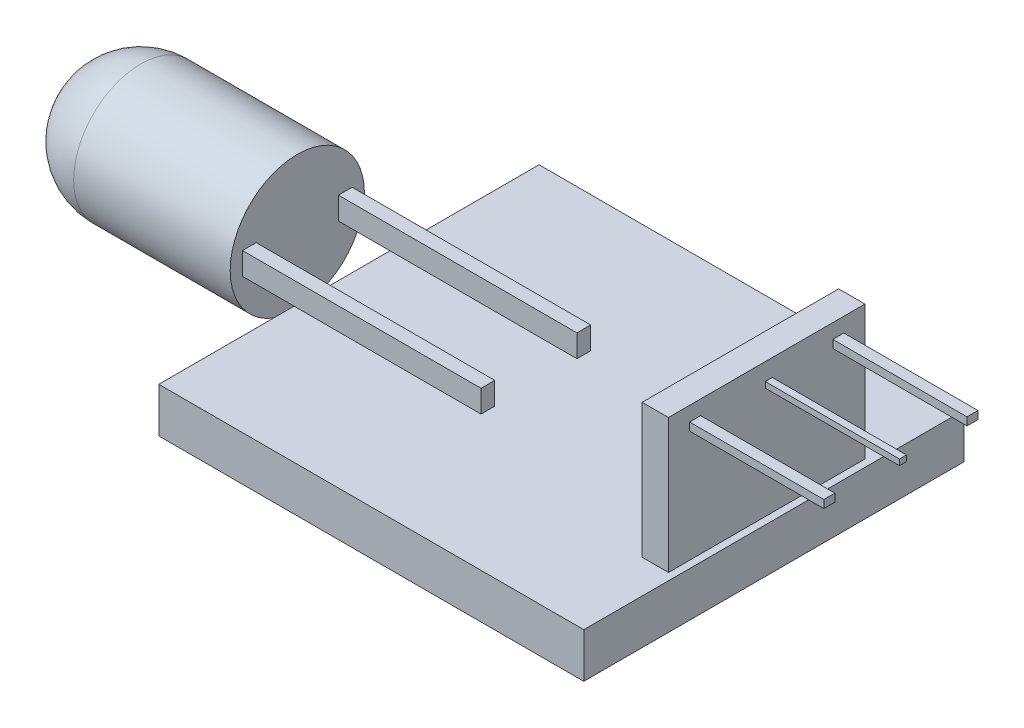
ISO-10303-21;
HEADER;
FILE_DESCRIPTION(('STEP AP214'),'2;1');
FILE_NAME('part.step','',(''),(''),'','','');
FILE_SCHEMA(('AUTOMOTIVE_DESIGN { 1 0 10303 214 1 1 1 1 }'));
ENDSEC;
DATA;
#1=APPLICATION_CONTEXT('core data for automotive mechanical design processes');
#2=APPLICATION_PROTOCOL_DEFINITION('international standard','automotive_design',2000,#1);
#3=PRODUCT_CONTEXT('',#1,'mechanical');
#4=PRODUCT('Part','Part','',(#3));
#5=PRODUCT_RELATED_PRODUCT_CATEGORY('part','',(#4));
#6=PRODUCT_DEFINITION_FORMATION('','',#4);
#7=PRODUCT_DEFINITION_CONTEXT('part definition',#1,'design');
#8=PRODUCT_DEFINITION('design','',#6,#7);
#9=PRODUCT_DEFINITION_SHAPE('','',#8);
#10=(LENGTH_UNIT() NAMED_UNIT(*) SI_UNIT(.MILLI.,.METRE.));
#11=(NAMED_UNIT(*) PLANE_ANGLE_UNIT() SI_UNIT($,.RADIAN.));
#12=(NAMED_UNIT(*) SI_UNIT($,.STERADIAN.) SOLID_ANGLE_UNIT());
#13=UNCERTAINTY_MEASURE_WITH_UNIT(LENGTH_MEASURE(1.E-05),#10,'distance_accuracy_value','');
#14=(GEOMETRIC_REPRESENTATION_CONTEXT(3) GLOBAL_UNCERTAINTY_ASSIGNED_CONTEXT((#13)) GLOBAL_UNIT_ASSIGNED_CONTEXT((#10,
#11,#12)) REPRESENTATION_CONTEXT('',''));
#15=CARTESIAN_POINT('',(0.,0.,0.));
#16=DIRECTION('',(0.,0.,1.));
#17=DIRECTION('',(1.,0.,0.));
#18=AXIS2_PLACEMENT_3D('',#15,#16,#17);
#19=CARTESIAN_POINT('',(0.,2.,0.));
#20=DIRECTION('',(0.,1.,0.));
#21=DIRECTION('',(0.,0.,1.));
#22=AXIS2_PLACEMENT_3D('',#19,#20,#21);
#23=PLANE('',#22);
#24=DIRECTION('',(-1.,0.,0.));
#25=VECTOR('',#24,1.);
#26=CARTESIAN_POINT('',(-1.80664428029186,2.,-1.83779397914057));
#27=LINE('',#26,#25);
#28=CARTESIAN_POINT('',(-1.1429964544911,2.,-1.83779397914057));
#29=VERTEX_POINT('',#28);
#30=CARTESIAN_POINT('',(-9.5,2.,-1.83779397914057));
#31=VERTEX_POINT('',#30);
#32=EDGE_CURVE('E55',#29,#31,#27,.T.);
#33=ORIENTED_EDGE('',*,*,#32,.T.);
#34=DIRECTION('',(0.,0.,1.));
#35=VECTOR('',#34,1.);
#36=CARTESIAN_POINT('',(-9.5,2.,-8.5));
#37=LINE('',#36,#35);
#38=CARTESIAN_POINT('',(-9.5,2.,1.83779397914057));
#39=VERTEX_POINT('',#38);
#40=EDGE_CURVE('E550',#31,#39,#37,.T.);
#41=ORIENTED_EDGE('',*,*,#40,.T.);
#42=DIRECTION('',(-1.,0.,0.));
#43=VECTOR('',#42,1.);
#44=CARTESIAN_POINT('',(-1.80664428029186,2.,1.83779397914057));
#45=LINE('',#44,#43);
#46=CARTESIAN_POINT('',(-1.1429964544911,2.,1.83779397914057));
#47=VERTEX_POINT('',#46);
#48=EDGE_CURVE('E336',#47,#39,#45,.T.);
#49=ORIENTED_EDGE('',*,*,#48,.F.);
#50=DIRECTION('',(0.,0.,-1.));
#51=VECTOR('',#50,1.);
#52=CARTESIAN_POINT('',(-1.1429964544911,2.,1.83779397914057));
#53=LINE('',#52,#51);
#54=CARTESIAN_POINT('',(-1.1429964544911,2.,2.45039197218743));
#55=VERTEX_POINT('',#54);
#56=EDGE_CURVE('E346',#55,#47,#53,.T.);
#57=ORIENTED_EDGE('',*,*,#56,.F.);
#58=DIRECTION('',(1.,0.,0.));
#59=VECTOR('',#58,1.);
#60=CARTESIAN_POINT('',(-1.80664428029186,2.,2.45039197218743));
#61=LINE('',#60,#59);
#62=CARTESIAN_POINT('',(-9.5,2.,2.45039197218743));
#63=VERTEX_POINT('',#62);
#64=EDGE_CURVE('E331',#63,#55,#61,.T.);
#65=ORIENTED_EDGE('',*,*,#64,.F.);
#66=CARTESIAN_POINT('',(-9.49999999999999,2.,8.5));
#67=VERTEX_POINT('',#66);
#68=EDGE_CURVE('E544',#63,#67,#37,.T.);
#69=ORIENTED_EDGE('',*,*,#68,.T.);
#70=DIRECTION('',(1.,0.,0.));
#71=VECTOR('',#70,1.);
#72=CARTESIAN_POINT('',(-9.49999999999999,2.,8.5));
#73=LINE('',#72,#71);
#74=CARTESIAN_POINT('',(9.50000000000001,2.,8.5));
#75=VERTEX_POINT('',#74);
#76=EDGE_CURVE('E549',#67,#75,#73,.T.);
#77=ORIENTED_EDGE('',*,*,#76,.T.);
#78=DIRECTION('',(0.,0.,-1.));
#79=VECTOR('',#78,1.);
#80=CARTESIAN_POINT('',(9.5,2.,-8.5));
#81=LINE('',#80,#79);
#82=CARTESIAN_POINT('',(9.5,2.,-8.5));
#83=VERTEX_POINT('',#82);
#84=EDGE_CURVE('E536',#75,#83,#81,.T.);
#85=ORIENTED_EDGE('',*,*,#84,.T.);
#86=DIRECTION('',(-1.,0.,0.));
#87=VECTOR('',#86,1.);
#88=CARTESIAN_POINT('',(-9.5,2.,-8.5));
#89=LINE('',#88,#87);
#90=CARTESIAN_POINT('',(-9.5,2.,-8.5));
#91=VERTEX_POINT('',#90);
#92=EDGE_CURVE('E540',#83,#91,#89,.T.);
#93=ORIENTED_EDGE('',*,*,#92,.T.);
#94=CARTESIAN_POINT('',(-9.5,2.,-2.45039197218743));
#95=VERTEX_POINT('',#94);
#96=EDGE_CURVE('E545',#91,#95,#37,.T.);
#97=ORIENTED_EDGE('',*,*,#96,.T.);
#98=DIRECTION('',(1.,0.,0.));
#99=VECTOR('',#98,1.);
#100=CARTESIAN_POINT('',(-1.80664428029186,2.,-2.45039197218743));
#101=LINE('',#100,#99);
#102=CARTESIAN_POINT('',(-1.1429964544911,2.,-2.45039197218743));
#103=VERTEX_POINT('',#102);
#104=EDGE_CURVE('E63',#95,#103,#101,.T.);
#105=ORIENTED_EDGE('',*,*,#104,.T.);
#106=DIRECTION('',(0.,0.,1.));
#107=VECTOR('',#106,1.);
#108=CARTESIAN_POINT('',(-1.1429964544911,2.,-1.83779397914057));
#109=LINE('',#108,#107);
#110=EDGE_CURVE('E292',#103,#29,#109,.T.);
#111=ORIENTED_EDGE('',*,*,#110,.T.);
#112=EDGE_LOOP('',(#33,#41,#49,#57,#65,#69,#77,#85,#93,#97,#105,#111));
#113=FACE_BOUND('',#112,.T.);
#114=DIRECTION('',(1.,0.,0.));
#115=VECTOR('',#114,1.);
#116=CARTESIAN_POINT('',(9.1777810006269,2.,4.39257162566455));
#117=LINE('',#116,#115);
#118=CARTESIAN_POINT('',(8.00114241080294,2.,4.39257162566455));
#119=VERTEX_POINT('',#118);
#120=CARTESIAN_POINT('',(9.1777810006269,2.,4.39257162566455));
#121=VERTEX_POINT('',#120);
#122=EDGE_CURVE('E513',#119,#121,#117,.T.);
#123=ORIENTED_EDGE('',*,*,#122,.F.);
#124=DIRECTION('',(0.,0.,1.));
#125=VECTOR('',#124,1.);
#126=CARTESIAN_POINT('',(8.00114241080294,2.,4.39257162566455));
#127=LINE('',#126,#125);
#128=CARTESIAN_POINT('',(8.00114241080294,2.,-4.39257162566455));
#129=VERTEX_POINT('',#128);
#130=EDGE_CURVE('E494',#129,#119,#127,.T.);
#131=ORIENTED_EDGE('',*,*,#130,.F.);
#132=DIRECTION('',(-1.,0.,0.));
#133=VECTOR('',#132,1.);
#134=CARTESIAN_POINT('',(9.1777810006269,2.,-4.39257162566455));
#135=LINE('',#134,#133);
#136=CARTESIAN_POINT('',(9.1777810006269,2.,-4.39257162566455));
#137=VERTEX_POINT('',#136);
#138=EDGE_CURVE('E500',#137,#129,#135,.T.);
#139=ORIENTED_EDGE('',*,*,#138,.F.);
#140=DIRECTION('',(0.,0.,-1.));
#141=VECTOR('',#140,1.);
#142=CARTESIAN_POINT('',(9.1777810006269,2.,4.39257162566455));
#143=LINE('',#142,#141);
#144=EDGE_CURVE('E516',#121,#137,#143,.T.);
#145=ORIENTED_EDGE('',*,*,#144,.F.);
#146=EDGE_LOOP('',(#123,#131,#139,#145));
#147=FACE_BOUND('',#146,.T.);
#148=ADVANCED_FACE('F39',(#113,#147),#23,.T.);
#149=CARTESIAN_POINT('',(9.1777810006269,8.,4.39257162566455));
#150=DIRECTION('',(-1.,0.,0.));
#151=DIRECTION('',(0.,0.,1.));
#152=AXIS2_PLACEMENT_3D('',#149,#150,#151);
#153=PLANE('',#152);
#154=DIRECTION('',(0.,-1.,0.));
#155=VECTOR('',#154,1.);
#156=CARTESIAN_POINT('',(9.1777810006269,7.35132355232617,3.4463804247977));
#157=LINE('',#156,#155);
#158=CARTESIAN_POINT('',(9.1777810006269,7.35132355232617,3.4463804247977));
#159=VERTEX_POINT('',#158);
#160=CARTESIAN_POINT('',(9.1777810006269,6.99965208040804,3.4463804247977));
#161=VERTEX_POINT('',#160);
#162=EDGE_CURVE('E449',#159,#161,#157,.T.);
#163=ORIENTED_EDGE('',*,*,#162,.F.);
#164=DIRECTION('',(0.,0.,1.));
#165=VECTOR('',#164,1.);
#166=CARTESIAN_POINT('',(9.1777810006269,7.35132355232617,3.4463804247977));
#167=LINE('',#166,#165);
#168=CARTESIAN_POINT('',(9.1777810006269,7.35132355232617,2.95404036411231));
#169=VERTEX_POINT('',#168);
#170=EDGE_CURVE('E455',#169,#159,#167,.T.);
#171=ORIENTED_EDGE('',*,*,#170,.F.);
#172=DIRECTION('',(0.,1.,0.));
#173=VECTOR('',#172,1.);
#174=CARTESIAN_POINT('',(9.1777810006269,7.35132355232617,2.95404036411231));
#175=LINE('',#174,#173);
#176=CARTESIAN_POINT('',(9.1777810006269,6.99965208040804,2.95404036411231));
#177=VERTEX_POINT('',#176);
#178=EDGE_CURVE('E472',#177,#169,#175,.T.);
#179=ORIENTED_EDGE('',*,*,#178,.F.);
#180=DIRECTION('',(0.,0.,-1.));
#181=VECTOR('',#180,1.);
#182=CARTESIAN_POINT('',(9.1777810006269,6.99965208040804,3.4463804247977));
#183=LINE('',#182,#181);
#184=EDGE_CURVE('E468',#161,#177,#183,.T.);
#185=ORIENTED_EDGE('',*,*,#184,.F.);
#186=EDGE_LOOP('',(#163,#171,#179,#185));
#187=FACE_BOUND('',#186,.T.);
#188=ORIENTED_EDGE('',*,*,#144,.T.);
#189=DIRECTION('',(0.,-1.,0.));
#190=VECTOR('',#189,1.);
#191=CARTESIAN_POINT('',(9.1777810006269,8.,-4.39257162566455));
#192=LINE('',#191,#190);
#193=CARTESIAN_POINT('',(9.1777810006269,8.,-4.39257162566455));
#194=VERTEX_POINT('',#193);
#195=EDGE_CURVE('E525',#194,#137,#192,.T.);
#196=ORIENTED_EDGE('',*,*,#195,.F.);
#197=DIRECTION('',(0.,0.,-1.));
#198=VECTOR('',#197,1.);
#199=CARTESIAN_POINT('',(9.1777810006269,8.,4.39257162566455));
#200=LINE('',#199,#198);
#201=CARTESIAN_POINT('',(9.1777810006269,8.,4.39257162566455));
#202=VERTEX_POINT('',#201);
#203=EDGE_CURVE('E503',#202,#194,#200,.T.);
#204=ORIENTED_EDGE('',*,*,#203,.F.);
#205=DIRECTION('',(0.,-1.,0.));
#206=VECTOR('',#205,1.);
#207=CARTESIAN_POINT('',(9.1777810006269,8.,4.39257162566455));
#208=LINE('',#207,#206);
#209=EDGE_CURVE('E528',#202,#121,#208,.T.);
#210=ORIENTED_EDGE('',*,*,#209,.T.);
#211=EDGE_LOOP('',(#188,#196,#204,#210));
#212=FACE_BOUND('',#211,.T.);
#213=DIRECTION('',(0.,0.,-1.));
#214=VECTOR('',#213,1.);
#215=CARTESIAN_POINT('',(9.1777810006269,7.35132355232617,-3.4463804247977));
#216=LINE('',#215,#214);
#217=CARTESIAN_POINT('',(9.1777810006269,7.35132355232617,-2.95404036411231));
#218=VERTEX_POINT('',#217);
#219=CARTESIAN_POINT('',(9.1777810006269,7.35132355232617,-3.4463804247977));
#220=VERTEX_POINT('',#219);
#221=EDGE_CURVE('E426',#218,#220,#216,.T.);
#222=ORIENTED_EDGE('',*,*,#221,.T.);
#223=DIRECTION('',(0.,-1.,0.));
#224=VECTOR('',#223,1.);
#225=CARTESIAN_POINT('',(9.1777810006269,7.35132355232617,-3.4463804247977));
#226=LINE('',#225,#224);
#227=CARTESIAN_POINT('',(9.1777810006269,6.99965208040804,-3.4463804247977));
#228=VERTEX_POINT('',#227);
#229=EDGE_CURVE('E404',#220,#228,#226,.T.);
#230=ORIENTED_EDGE('',*,*,#229,.T.);
#231=DIRECTION('',(0.,0.,1.));
#232=VECTOR('',#231,1.);
#233=CARTESIAN_POINT('',(9.1777810006269,6.99965208040804,-3.4463804247977));
#234=LINE('',#233,#232);
#235=CARTESIAN_POINT('',(9.1777810006269,6.99965208040804,-2.95404036411231));
#236=VERTEX_POINT('',#235);
#237=EDGE_CURVE('E410',#228,#236,#234,.T.);
#238=ORIENTED_EDGE('',*,*,#237,.T.);
#239=DIRECTION('',(0.,1.,0.));
#240=VECTOR('',#239,1.);
#241=CARTESIAN_POINT('',(9.1777810006269,7.35132355232617,-2.95404036411231));
#242=LINE('',#241,#240);
#243=EDGE_CURVE('E430',#236,#218,#242,.T.);
#244=ORIENTED_EDGE('',*,*,#243,.T.);
#245=EDGE_LOOP('',(#222,#230,#238,#244));
#246=FACE_BOUND('',#245,.T.);
#247=DIRECTION('',(0.,-1.,0.));
#248=VECTOR('',#247,1.);
#249=CARTESIAN_POINT('',(9.1777810006269,7.22880019291106,0.0643645900515466));
#250=LINE('',#249,#248);
#251=CARTESIAN_POINT('',(9.1777810006269,7.22880019291106,0.0643645900515466));
#252=VERTEX_POINT('',#251);
#253=CARTESIAN_POINT('',(9.1777810006269,6.97107621355553,0.0643645900515466));
#254=VERTEX_POINT('',#253);
#255=EDGE_CURVE('E359',#252,#254,#250,.T.);
#256=ORIENTED_EDGE('',*,*,#255,.F.);
#257=DIRECTION('',(0.,0.,1.));
#258=VECTOR('',#257,1.);
#259=CARTESIAN_POINT('',(9.1777810006269,7.22880019291106,0.0643645900515466));
#260=LINE('',#259,#258);
#261=CARTESIAN_POINT('',(9.1777810006269,7.22880019291106,-0.248789451396059));
#262=VERTEX_POINT('',#261);
#263=EDGE_CURVE('E365',#262,#252,#260,.T.);
#264=ORIENTED_EDGE('',*,*,#263,.F.);
#265=DIRECTION('',(0.,1.,0.));
#266=VECTOR('',#265,1.);
#267=CARTESIAN_POINT('',(9.1777810006269,7.22880019291106,-0.248789451396059));
#268=LINE('',#267,#266);
#269=CARTESIAN_POINT('',(9.1777810006269,6.97107621355553,-0.248789451396059));
#270=VERTEX_POINT('',#269);
#271=EDGE_CURVE('E382',#270,#262,#268,.T.);
#272=ORIENTED_EDGE('',*,*,#271,.F.);
#273=DIRECTION('',(0.,0.,-1.));
#274=VECTOR('',#273,1.);
#275=CARTESIAN_POINT('',(9.1777810006269,6.97107621355553,0.0643645900515466));
#276=LINE('',#275,#274);
#277=EDGE_CURVE('E378',#254,#270,#276,.T.);
#278=ORIENTED_EDGE('',*,*,#277,.F.);
#279=EDGE_LOOP('',(#256,#264,#272,#278));
#280=FACE_BOUND('',#279,.T.);
#281=ADVANCED_FACE('F634',(#187,#212,#246,#280),#153,.F.);
#282=CARTESIAN_POINT('',(9.5,2.,-8.5));
#283=DIRECTION('',(-1.,0.,0.));
#284=DIRECTION('',(0.,0.,1.));
#285=AXIS2_PLACEMENT_3D('',#282,#283,#284);
#286=PLANE('',#285);
#287=DIRECTION('',(0.,0.,-1.));
#288=VECTOR('',#287,1.);
#289=CARTESIAN_POINT('',(9.5,0.,-8.5));
#290=LINE('',#289,#288);
#291=CARTESIAN_POINT('',(9.50000000000001,0.,8.5));
#292=VERTEX_POINT('',#291);
#293=CARTESIAN_POINT('',(9.5,0.,-8.5));
#294=VERTEX_POINT('',#293);
#295=EDGE_CURVE('E535',#292,#294,#290,.T.);
#296=ORIENTED_EDGE('',*,*,#295,.T.);
#297=DIRECTION('',(0.,-1.,0.));
#298=VECTOR('',#297,1.);
#299=CARTESIAN_POINT('',(9.5,2.,-8.5));
#300=LINE('',#299,#298);
#301=EDGE_CURVE('E48',#83,#294,#300,.T.);
#302=ORIENTED_EDGE('',*,*,#301,.F.);
#303=ORIENTED_EDGE('',*,*,#84,.F.);
#304=DIRECTION('',(0.,-1.,0.));
#305=VECTOR('',#304,1.);
#306=CARTESIAN_POINT('',(9.50000000000001,2.,8.5));
#307=LINE('',#306,#305);
#308=EDGE_CURVE('E553',#75,#292,#307,.T.);
#309=ORIENTED_EDGE('',*,*,#308,.T.);
#310=EDGE_LOOP('',(#296,#302,#303,#309));
#311=FACE_BOUND('',#310,.T.);
#312=ADVANCED_FACE('F584',(#311),#286,.F.);
#313=CARTESIAN_POINT('',(-9.5,2.,-8.5));
#314=DIRECTION('',(0.,0.,1.));
#315=DIRECTION('',(1.,0.,0.));
#316=AXIS2_PLACEMENT_3D('',#313,#314,#315);
#317=PLANE('',#316);
#318=DIRECTION('',(-1.,0.,0.));
#319=VECTOR('',#318,1.);
#320=CARTESIAN_POINT('',(-9.5,0.,-8.5));
#321=LINE('',#320,#319);
#322=CARTESIAN_POINT('',(-9.5,0.,-8.5));
#323=VERTEX_POINT('',#322);
#324=EDGE_CURVE('E557',#294,#323,#321,.T.);
#325=ORIENTED_EDGE('',*,*,#324,.T.);
#326=DIRECTION('',(0.,-1.,0.));
#327=VECTOR('',#326,1.);
#328=CARTESIAN_POINT('',(-9.5,2.,-8.5));
#329=LINE('',#328,#327);
#330=EDGE_CURVE('E572',#91,#323,#329,.T.);
#331=ORIENTED_EDGE('',*,*,#330,.F.);
#332=ORIENTED_EDGE('',*,*,#92,.F.);
#333=ORIENTED_EDGE('',*,*,#301,.T.);
#334=EDGE_LOOP('',(#325,#331,#332,#333));
#335=FACE_BOUND('',#334,.T.);
#336=ADVANCED_FACE('F579',(#335),#317,.F.);
#337=CARTESIAN_POINT('',(-9.5,2.,-8.5));
#338=DIRECTION('',(1.,0.,0.));
#339=DIRECTION('',(0.,0.,-1.));
#340=AXIS2_PLACEMENT_3D('',#337,#338,#339);
#341=PLANE('',#340);
#342=DIRECTION('',(0.,0.,1.));
#343=VECTOR('',#342,1.);
#344=CARTESIAN_POINT('',(-9.5,0.,-8.5));
#345=LINE('',#344,#343);
#346=CARTESIAN_POINT('',(-9.49999999999999,0.,8.5));
#347=VERTEX_POINT('',#346);
#348=EDGE_CURVE('E560',#323,#347,#345,.T.);
#349=ORIENTED_EDGE('',*,*,#348,.T.);
#350=DIRECTION('',(0.,-1.,0.));
#351=VECTOR('',#350,1.);
#352=CARTESIAN_POINT('',(-9.49999999999999,2.,8.5));
#353=LINE('',#352,#351);
#354=EDGE_CURVE('E568',#67,#347,#353,.T.);
#355=ORIENTED_EDGE('',*,*,#354,.F.);
#356=ORIENTED_EDGE('',*,*,#68,.F.);
#357=DIRECTION('',(0.,0.,1.));
#358=VECTOR('',#357,1.);
#359=CARTESIAN_POINT('',(-9.5,2.,-8.5));
#360=LINE('',#359,#358);
#361=EDGE_CURVE('E327',#39,#63,#360,.T.);
#362=ORIENTED_EDGE('',*,*,#361,.F.);
#363=ORIENTED_EDGE('',*,*,#40,.F.);
#364=DIRECTION('',(0.,0.,-1.));
#365=VECTOR('',#364,1.);
#366=CARTESIAN_POINT('',(-9.5,2.,-8.5));
#367=LINE('',#366,#365);
#368=EDGE_CURVE('E254',#31,#95,#367,.T.);
#369=ORIENTED_EDGE('',*,*,#368,.T.);
#370=ORIENTED_EDGE('',*,*,#96,.F.);
#371=ORIENTED_EDGE('',*,*,#330,.T.);
#372=EDGE_LOOP('',(#349,#355,#356,#362,#363,#369,#370,#371));
#373=FACE_BOUND('',#372,.T.);
#374=ADVANCED_FACE('F592',(#373),#341,.F.);
#375=CARTESIAN_POINT('',(-9.49999999999999,2.,8.5));
#376=DIRECTION('',(0.,0.,-1.));
#377=DIRECTION('',(-1.,0.,0.));
#378=AXIS2_PLACEMENT_3D('',#375,#376,#377);
#379=PLANE('',#378);
#380=DIRECTION('',(1.,0.,0.));
#381=VECTOR('',#380,1.);
#382=CARTESIAN_POINT('',(-9.49999999999999,0.,8.5));
#383=LINE('',#382,#381);
#384=EDGE_CURVE('E541',#347,#292,#383,.T.);
#385=ORIENTED_EDGE('',*,*,#384,.T.);
#386=ORIENTED_EDGE('',*,*,#308,.F.);
#387=ORIENTED_EDGE('',*,*,#76,.F.);
#388=ORIENTED_EDGE('',*,*,#354,.T.);
#389=EDGE_LOOP('',(#385,#386,#387,#388));
#390=FACE_BOUND('',#389,.T.);
#391=ADVANCED_FACE('F597',(#390),#379,.F.);
#392=CARTESIAN_POINT('',(0.,0.,0.));
#393=DIRECTION('',(0.,1.,0.));
#394=DIRECTION('',(0.,0.,1.));
#395=AXIS2_PLACEMENT_3D('',#392,#393,#394);
#396=PLANE('',#395);
#397=ORIENTED_EDGE('',*,*,#295,.F.);
#398=ORIENTED_EDGE('',*,*,#384,.F.);
#399=ORIENTED_EDGE('',*,*,#348,.F.);
#400=ORIENTED_EDGE('',*,*,#324,.F.);
#401=EDGE_LOOP('',(#397,#398,#399,#400));
#402=FACE_BOUND('',#401,.T.);
#403=ADVANCED_FACE('F588',(#402),#396,.F.);
#404=CARTESIAN_POINT('',(8.00114241080294,8.,4.39257162566455));
#405=DIRECTION('',(1.,0.,0.));
#406=DIRECTION('',(0.,0.,-1.));
#407=AXIS2_PLACEMENT_3D('',#404,#405,#406);
#408=PLANE('',#407);
#409=ORIENTED_EDGE('',*,*,#130,.T.);
#410=DIRECTION('',(0.,-1.,0.));
#411=VECTOR('',#410,1.);
#412=CARTESIAN_POINT('',(8.00114241080294,8.,4.39257162566455));
#413=LINE('',#412,#411);
#414=CARTESIAN_POINT('',(8.00114241080294,8.,4.39257162566455));
#415=VERTEX_POINT('',#414);
#416=EDGE_CURVE('E532',#415,#119,#413,.T.);
#417=ORIENTED_EDGE('',*,*,#416,.F.);
#418=DIRECTION('',(0.,0.,1.));
#419=VECTOR('',#418,1.);
#420=CARTESIAN_POINT('',(8.00114241080294,8.,4.39257162566455));
#421=LINE('',#420,#419);
#422=CARTESIAN_POINT('',(8.00114241080294,8.,-4.39257162566455));
#423=VERTEX_POINT('',#422);
#424=EDGE_CURVE('E495',#423,#415,#421,.T.);
#425=ORIENTED_EDGE('',*,*,#424,.F.);
#426=DIRECTION('',(0.,-1.,0.));
#427=VECTOR('',#426,1.);
#428=CARTESIAN_POINT('',(8.00114241080294,8.,-4.39257162566455));
#429=LINE('',#428,#427);
#430=EDGE_CURVE('E509',#423,#129,#429,.T.);
#431=ORIENTED_EDGE('',*,*,#430,.T.);
#432=EDGE_LOOP('',(#409,#417,#425,#431));
#433=FACE_BOUND('',#432,.T.);
#434=ADVANCED_FACE('F643',(#433),#408,.F.);
#435=CARTESIAN_POINT('',(9.1777810006269,8.,4.39257162566455));
#436=DIRECTION('',(0.,0.,-1.));
#437=DIRECTION('',(-1.,0.,0.));
#438=AXIS2_PLACEMENT_3D('',#435,#436,#437);
#439=PLANE('',#438);
#440=ORIENTED_EDGE('',*,*,#122,.T.);
#441=ORIENTED_EDGE('',*,*,#209,.F.);
#442=DIRECTION('',(1.,0.,0.));
#443=VECTOR('',#442,1.);
#444=CARTESIAN_POINT('',(9.1777810006269,8.,4.39257162566455));
#445=LINE('',#444,#443);
#446=EDGE_CURVE('E499',#415,#202,#445,.T.);
#447=ORIENTED_EDGE('',*,*,#446,.F.);
#448=ORIENTED_EDGE('',*,*,#416,.T.);
#449=EDGE_LOOP('',(#440,#441,#447,#448));
#450=FACE_BOUND('',#449,.T.);
#451=ADVANCED_FACE('F680',(#450),#439,.F.);
#452=CARTESIAN_POINT('',(9.1777810006269,8.,-4.39257162566455));
#453=DIRECTION('',(0.,0.,1.));
#454=DIRECTION('',(1.,0.,0.));
#455=AXIS2_PLACEMENT_3D('',#452,#453,#454);
#456=PLANE('',#455);
#457=ORIENTED_EDGE('',*,*,#138,.T.);
#458=ORIENTED_EDGE('',*,*,#430,.F.);
#459=DIRECTION('',(-1.,0.,0.));
#460=VECTOR('',#459,1.);
#461=CARTESIAN_POINT('',(9.1777810006269,8.,-4.39257162566455));
#462=LINE('',#461,#460);
#463=EDGE_CURVE('E506',#194,#423,#462,.T.);
#464=ORIENTED_EDGE('',*,*,#463,.F.);
#465=ORIENTED_EDGE('',*,*,#195,.T.);
#466=EDGE_LOOP('',(#457,#458,#464,#465));
#467=FACE_BOUND('',#466,.T.);
#468=ADVANCED_FACE('F687',(#467),#456,.F.);
#469=CARTESIAN_POINT('',(0.,8.,0.));
#470=DIRECTION('',(0.,1.,0.));
#471=DIRECTION('',(0.,0.,1.));
#472=AXIS2_PLACEMENT_3D('',#469,#470,#471);
#473=PLANE('',#472);
#474=ORIENTED_EDGE('',*,*,#424,.T.);
#475=ORIENTED_EDGE('',*,*,#446,.T.);
#476=ORIENTED_EDGE('',*,*,#203,.T.);
#477=ORIENTED_EDGE('',*,*,#463,.T.);
#478=EDGE_LOOP('',(#474,#475,#476,#477));
#479=FACE_BOUND('',#478,.T.);
#480=ADVANCED_FACE('F694',(#479),#473,.T.);
#481=CARTESIAN_POINT('',(15.1777810006269,7.35132355232617,3.4463804247977));
#482=DIRECTION('',(0.,0.,-1.));
#483=DIRECTION('',(-1.,0.,0.));
#484=AXIS2_PLACEMENT_3D('',#481,#482,#483);
#485=PLANE('',#484);
#486=ORIENTED_EDGE('',*,*,#162,.T.);
#487=DIRECTION('',(-1.,0.,0.));
#488=VECTOR('',#487,1.);
#489=CARTESIAN_POINT('',(15.1777810006269,6.99965208040804,3.4463804247977));
#490=LINE('',#489,#488);
#491=CARTESIAN_POINT('',(15.1777810006269,6.99965208040804,3.4463804247977));
#492=VERTEX_POINT('',#491);
#493=EDGE_CURVE('E490',#492,#161,#490,.T.);
#494=ORIENTED_EDGE('',*,*,#493,.F.);
#495=DIRECTION('',(0.,-1.,0.));
#496=VECTOR('',#495,1.);
#497=CARTESIAN_POINT('',(15.1777810006269,7.35132355232617,3.4463804247977));
#498=LINE('',#497,#496);
#499=CARTESIAN_POINT('',(15.1777810006269,7.35132355232617,3.4463804247977));
#500=VERTEX_POINT('',#499);
#501=EDGE_CURVE('E450',#500,#492,#498,.T.);
#502=ORIENTED_EDGE('',*,*,#501,.F.);
#503=DIRECTION('',(-1.,0.,0.));
#504=VECTOR('',#503,1.);
#505=CARTESIAN_POINT('',(15.1777810006269,7.35132355232617,3.4463804247977));
#506=LINE('',#505,#504);
#507=EDGE_CURVE('E464',#500,#159,#506,.T.);
#508=ORIENTED_EDGE('',*,*,#507,.T.);
#509=EDGE_LOOP('',(#486,#494,#502,#508));
#510=FACE_BOUND('',#509,.T.);
#511=ADVANCED_FACE('F702',(#510),#485,.F.);
#512=CARTESIAN_POINT('',(15.1777810006269,6.99965208040804,3.4463804247977));
#513=DIRECTION('',(0.,1.,0.));
#514=DIRECTION('',(0.,0.,1.));
#515=AXIS2_PLACEMENT_3D('',#512,#513,#514);
#516=PLANE('',#515);
#517=ORIENTED_EDGE('',*,*,#184,.T.);
#518=DIRECTION('',(-1.,0.,0.));
#519=VECTOR('',#518,1.);
#520=CARTESIAN_POINT('',(15.1777810006269,6.99965208040804,2.95404036411231));
#521=LINE('',#520,#519);
#522=CARTESIAN_POINT('',(15.1777810006269,6.99965208040804,2.95404036411231));
#523=VERTEX_POINT('',#522);
#524=EDGE_CURVE('E486',#523,#177,#521,.T.);
#525=ORIENTED_EDGE('',*,*,#524,.F.);
#526=DIRECTION('',(0.,0.,-1.));
#527=VECTOR('',#526,1.);
#528=CARTESIAN_POINT('',(15.1777810006269,6.99965208040804,3.4463804247977));
#529=LINE('',#528,#527);
#530=EDGE_CURVE('E454',#492,#523,#529,.T.);
#531=ORIENTED_EDGE('',*,*,#530,.F.);
#532=ORIENTED_EDGE('',*,*,#493,.T.);
#533=EDGE_LOOP('',(#517,#525,#531,#532));
#534=FACE_BOUND('',#533,.T.);
#535=ADVANCED_FACE('F710',(#534),#516,.F.);
#536=CARTESIAN_POINT('',(15.1777810006269,7.35132355232617,2.95404036411231));
#537=DIRECTION('',(0.,0.,1.));
#538=DIRECTION('',(1.,0.,0.));
#539=AXIS2_PLACEMENT_3D('',#536,#537,#538);
#540=PLANE('',#539);
#541=ORIENTED_EDGE('',*,*,#178,.T.);
#542=DIRECTION('',(-1.,0.,0.));
#543=VECTOR('',#542,1.);
#544=CARTESIAN_POINT('',(15.1777810006269,7.35132355232617,2.95404036411231));
#545=LINE('',#544,#543);
#546=CARTESIAN_POINT('',(15.1777810006269,7.35132355232617,2.95404036411231));
#547=VERTEX_POINT('',#546);
#548=EDGE_CURVE('E482',#547,#169,#545,.T.);
#549=ORIENTED_EDGE('',*,*,#548,.F.);
#550=DIRECTION('',(0.,1.,0.));
#551=VECTOR('',#550,1.);
#552=CARTESIAN_POINT('',(15.1777810006269,7.35132355232617,2.95404036411231));
#553=LINE('',#552,#551);
#554=EDGE_CURVE('E458',#523,#547,#553,.T.);
#555=ORIENTED_EDGE('',*,*,#554,.F.);
#556=ORIENTED_EDGE('',*,*,#524,.T.);
#557=EDGE_LOOP('',(#541,#549,#555,#556));
#558=FACE_BOUND('',#557,.T.);
#559=ADVANCED_FACE('F718',(#558),#540,.F.);
#560=CARTESIAN_POINT('',(15.1777810006269,7.35132355232617,3.4463804247977));
#561=DIRECTION('',(0.,-1.,0.));
#562=DIRECTION('',(0.,0.,-1.));
#563=AXIS2_PLACEMENT_3D('',#560,#561,#562);
#564=PLANE('',#563);
#565=ORIENTED_EDGE('',*,*,#170,.T.);
#566=ORIENTED_EDGE('',*,*,#507,.F.);
#567=DIRECTION('',(0.,0.,1.));
#568=VECTOR('',#567,1.);
#569=CARTESIAN_POINT('',(15.1777810006269,7.35132355232617,3.4463804247977));
#570=LINE('',#569,#568);
#571=EDGE_CURVE('E461',#547,#500,#570,.T.);
#572=ORIENTED_EDGE('',*,*,#571,.F.);
#573=ORIENTED_EDGE('',*,*,#548,.T.);
#574=EDGE_LOOP('',(#565,#566,#572,#573));
#575=FACE_BOUND('',#574,.T.);
#576=ADVANCED_FACE('F726',(#575),#564,.F.);
#577=CARTESIAN_POINT('',(15.1777810006269,0.,0.));
#578=DIRECTION('',(1.,0.,0.));
#579=DIRECTION('',(0.,0.,-1.));
#580=AXIS2_PLACEMENT_3D('',#577,#578,#579);
#581=PLANE('',#580);
#582=ORIENTED_EDGE('',*,*,#501,.T.);
#583=ORIENTED_EDGE('',*,*,#530,.T.);
#584=ORIENTED_EDGE('',*,*,#554,.T.);
#585=ORIENTED_EDGE('',*,*,#571,.T.);
#586=EDGE_LOOP('',(#582,#583,#584,#585));
#587=FACE_BOUND('',#586,.T.);
#588=ADVANCED_FACE('F734',(#587),#581,.T.);
#589=CARTESIAN_POINT('',(15.1777810006269,7.35132355232617,-3.4463804247977));
#590=DIRECTION('',(0.,0.,-1.));
#591=DIRECTION('',(-1.,0.,0.));
#592=AXIS2_PLACEMENT_3D('',#589,#590,#591);
#593=PLANE('',#592);
#594=ORIENTED_EDGE('',*,*,#229,.F.);
#595=DIRECTION('',(-1.,0.,0.));
#596=VECTOR('',#595,1.);
#597=CARTESIAN_POINT('',(15.1777810006269,7.35132355232617,-3.4463804247977));
#598=LINE('',#597,#596);
#599=CARTESIAN_POINT('',(15.1777810006269,7.35132355232617,-3.4463804247977));
#600=VERTEX_POINT('',#599);
#601=EDGE_CURVE('E446',#600,#220,#598,.T.);
#602=ORIENTED_EDGE('',*,*,#601,.F.);
#603=DIRECTION('',(0.,-1.,0.));
#604=VECTOR('',#603,1.);
#605=CARTESIAN_POINT('',(15.1777810006269,7.35132355232617,-3.4463804247977));
#606=LINE('',#605,#604);
#607=CARTESIAN_POINT('',(15.1777810006269,6.99965208040804,-3.4463804247977));
#608=VERTEX_POINT('',#607);
#609=EDGE_CURVE('E405',#600,#608,#606,.T.);
#610=ORIENTED_EDGE('',*,*,#609,.T.);
#611=DIRECTION('',(-1.,0.,0.));
#612=VECTOR('',#611,1.);
#613=CARTESIAN_POINT('',(15.1777810006269,6.99965208040804,-3.4463804247977));
#614=LINE('',#613,#612);
#615=EDGE_CURVE('E422',#608,#228,#614,.T.);
#616=ORIENTED_EDGE('',*,*,#615,.T.);
#617=EDGE_LOOP('',(#594,#602,#610,#616));
#618=FACE_BOUND('',#617,.T.);
#619=ADVANCED_FACE('F742',(#618),#593,.T.);
#620=CARTESIAN_POINT('',(15.1777810006269,7.35132355232617,-3.4463804247977));
#621=DIRECTION('',(0.,1.,0.));
#622=DIRECTION('',(0.,0.,1.));
#623=AXIS2_PLACEMENT_3D('',#620,#621,#622);
#624=PLANE('',#623);
#625=ORIENTED_EDGE('',*,*,#221,.F.);
#626=DIRECTION('',(-1.,0.,0.));
#627=VECTOR('',#626,1.);
#628=CARTESIAN_POINT('',(15.1777810006269,7.35132355232617,-2.95404036411231));
#629=LINE('',#628,#627);
#630=CARTESIAN_POINT('',(15.1777810006269,7.35132355232617,-2.95404036411231));
#631=VERTEX_POINT('',#630);
#632=EDGE_CURVE('E443',#631,#218,#629,.T.);
#633=ORIENTED_EDGE('',*,*,#632,.F.);
#634=DIRECTION('',(0.,0.,-1.));
#635=VECTOR('',#634,1.);
#636=CARTESIAN_POINT('',(15.1777810006269,7.35132355232617,-3.4463804247977));
#637=LINE('',#636,#635);
#638=EDGE_CURVE('E409',#631,#600,#637,.T.);
#639=ORIENTED_EDGE('',*,*,#638,.T.);
#640=ORIENTED_EDGE('',*,*,#601,.T.);
#641=EDGE_LOOP('',(#625,#633,#639,#640));
#642=FACE_BOUND('',#641,.T.);
#643=ADVANCED_FACE('F750',(#642),#624,.T.);
#644=CARTESIAN_POINT('',(15.1777810006269,7.35132355232617,-2.95404036411231));
#645=DIRECTION('',(0.,0.,1.));
#646=DIRECTION('',(1.,0.,0.));
#647=AXIS2_PLACEMENT_3D('',#644,#645,#646);
#648=PLANE('',#647);
#649=ORIENTED_EDGE('',*,*,#243,.F.);
#650=DIRECTION('',(-1.,0.,0.));
#651=VECTOR('',#650,1.);
#652=CARTESIAN_POINT('',(15.1777810006269,6.99965208040804,-2.95404036411231));
#653=LINE('',#652,#651);
#654=CARTESIAN_POINT('',(15.1777810006269,6.99965208040804,-2.95404036411231));
#655=VERTEX_POINT('',#654);
#656=EDGE_CURVE('E439',#655,#236,#653,.T.);
#657=ORIENTED_EDGE('',*,*,#656,.F.);
#658=DIRECTION('',(0.,1.,0.));
#659=VECTOR('',#658,1.);
#660=CARTESIAN_POINT('',(15.1777810006269,7.35132355232617,-2.95404036411231));
#661=LINE('',#660,#659);
#662=EDGE_CURVE('E414',#655,#631,#661,.T.);
#663=ORIENTED_EDGE('',*,*,#662,.T.);
#664=ORIENTED_EDGE('',*,*,#632,.T.);
#665=EDGE_LOOP('',(#649,#657,#663,#664));
#666=FACE_BOUND('',#665,.T.);
#667=ADVANCED_FACE('F758',(#666),#648,.T.);
#668=CARTESIAN_POINT('',(15.1777810006269,6.99965208040804,-3.4463804247977));
#669=DIRECTION('',(0.,-1.,0.));
#670=DIRECTION('',(0.,0.,-1.));
#671=AXIS2_PLACEMENT_3D('',#668,#669,#670);
#672=PLANE('',#671);
#673=ORIENTED_EDGE('',*,*,#237,.F.);
#674=ORIENTED_EDGE('',*,*,#615,.F.);
#675=DIRECTION('',(0.,0.,1.));
#676=VECTOR('',#675,1.);
#677=CARTESIAN_POINT('',(15.1777810006269,6.99965208040804,-3.4463804247977));
#678=LINE('',#677,#676);
#679=EDGE_CURVE('E418',#608,#655,#678,.T.);
#680=ORIENTED_EDGE('',*,*,#679,.T.);
#681=ORIENTED_EDGE('',*,*,#656,.T.);
#682=EDGE_LOOP('',(#673,#674,#680,#681));
#683=FACE_BOUND('',#682,.T.);
#684=ADVANCED_FACE('F766',(#683),#672,.T.);
#685=CARTESIAN_POINT('',(15.1777810006269,0.,0.));
#686=DIRECTION('',(1.,0.,0.));
#687=DIRECTION('',(0.,0.,1.));
#688=AXIS2_PLACEMENT_3D('',#685,#686,#687);
#689=PLANE('',#688);
#690=ORIENTED_EDGE('',*,*,#609,.F.);
#691=ORIENTED_EDGE('',*,*,#638,.F.);
#692=ORIENTED_EDGE('',*,*,#662,.F.);
#693=ORIENTED_EDGE('',*,*,#679,.F.);
#694=EDGE_LOOP('',(#690,#691,#692,#693));
#695=FACE_BOUND('',#694,.T.);
#696=ADVANCED_FACE('F774',(#695),#689,.T.);
#697=CARTESIAN_POINT('',(15.1777810006269,7.22880019291106,0.0643645900515466));
#698=DIRECTION('',(0.,0.,-1.));
#699=DIRECTION('',(-1.,0.,0.));
#700=AXIS2_PLACEMENT_3D('',#697,#698,#699);
#701=PLANE('',#700);
#702=ORIENTED_EDGE('',*,*,#255,.T.);
#703=DIRECTION('',(-1.,0.,0.));
#704=VECTOR('',#703,1.);
#705=CARTESIAN_POINT('',(15.1777810006269,6.97107621355553,0.0643645900515466));
#706=LINE('',#705,#704);
#707=CARTESIAN_POINT('',(15.1777810006269,6.97107621355553,0.0643645900515466));
#708=VERTEX_POINT('',#707);
#709=EDGE_CURVE('E400',#708,#254,#706,.T.);
#710=ORIENTED_EDGE('',*,*,#709,.F.);
#711=DIRECTION('',(0.,-1.,0.));
#712=VECTOR('',#711,1.);
#713=CARTESIAN_POINT('',(15.1777810006269,7.22880019291106,0.0643645900515466));
#714=LINE('',#713,#712);
#715=CARTESIAN_POINT('',(15.1777810006269,7.22880019291106,0.0643645900515466));
#716=VERTEX_POINT('',#715);
#717=EDGE_CURVE('E360',#716,#708,#714,.T.);
#718=ORIENTED_EDGE('',*,*,#717,.F.);
#719=DIRECTION('',(-1.,0.,0.));
#720=VECTOR('',#719,1.);
#721=CARTESIAN_POINT('',(15.1777810006269,7.22880019291106,0.0643645900515466));
#722=LINE('',#721,#720);
#723=EDGE_CURVE('E374',#716,#252,#722,.T.);
#724=ORIENTED_EDGE('',*,*,#723,.T.);
#725=EDGE_LOOP('',(#702,#710,#718,#724));
#726=FACE_BOUND('',#725,.T.);
#727=ADVANCED_FACE('F782',(#726),#701,.F.);
#728=CARTESIAN_POINT('',(15.1777810006269,6.97107621355553,0.0643645900515466));
#729=DIRECTION('',(0.,1.,0.));
#730=DIRECTION('',(0.,0.,1.));
#731=AXIS2_PLACEMENT_3D('',#728,#729,#730);
#732=PLANE('',#731);
#733=ORIENTED_EDGE('',*,*,#277,.T.);
#734=DIRECTION('',(-1.,0.,0.));
#735=VECTOR('',#734,1.);
#736=CARTESIAN_POINT('',(15.1777810006269,6.97107621355553,-0.248789451396059));
#737=LINE('',#736,#735);
#738=CARTESIAN_POINT('',(15.1777810006269,6.97107621355553,-0.248789451396059));
#739=VERTEX_POINT('',#738);
#740=EDGE_CURVE('E396',#739,#270,#737,.T.);
#741=ORIENTED_EDGE('',*,*,#740,.F.);
#742=DIRECTION('',(0.,0.,-1.));
#743=VECTOR('',#742,1.);
#744=CARTESIAN_POINT('',(15.1777810006269,6.97107621355553,0.0643645900515466));
#745=LINE('',#744,#743);
#746=EDGE_CURVE('E364',#708,#739,#745,.T.);
#747=ORIENTED_EDGE('',*,*,#746,.F.);
#748=ORIENTED_EDGE('',*,*,#709,.T.);
#749=EDGE_LOOP('',(#733,#741,#747,#748));
#750=FACE_BOUND('',#749,.T.);
#751=ADVANCED_FACE('F790',(#750),#732,.F.);
#752=CARTESIAN_POINT('',(15.1777810006269,7.22880019291106,-0.248789451396059));
#753=DIRECTION('',(0.,0.,1.));
#754=DIRECTION('',(1.,0.,0.));
#755=AXIS2_PLACEMENT_3D('',#752,#753,#754);
#756=PLANE('',#755);
#757=ORIENTED_EDGE('',*,*,#271,.T.);
#758=DIRECTION('',(-1.,0.,0.));
#759=VECTOR('',#758,1.);
#760=CARTESIAN_POINT('',(15.1777810006269,7.22880019291106,-0.248789451396059));
#761=LINE('',#760,#759);
#762=CARTESIAN_POINT('',(15.1777810006269,7.22880019291106,-0.248789451396059));
#763=VERTEX_POINT('',#762);
#764=EDGE_CURVE('E392',#763,#262,#761,.T.);
#765=ORIENTED_EDGE('',*,*,#764,.F.);
#766=DIRECTION('',(0.,1.,0.));
#767=VECTOR('',#766,1.);
#768=CARTESIAN_POINT('',(15.1777810006269,7.22880019291106,-0.248789451396059));
#769=LINE('',#768,#767);
#770=EDGE_CURVE('E368',#739,#763,#769,.T.);
#771=ORIENTED_EDGE('',*,*,#770,.F.);
#772=ORIENTED_EDGE('',*,*,#740,.T.);
#773=EDGE_LOOP('',(#757,#765,#771,#772));
#774=FACE_BOUND('',#773,.T.);
#775=ADVANCED_FACE('F798',(#774),#756,.F.);
#776=CARTESIAN_POINT('',(15.1777810006269,7.22880019291106,0.0643645900515466));
#777=DIRECTION('',(0.,-1.,0.));
#778=DIRECTION('',(0.,0.,-1.));
#779=AXIS2_PLACEMENT_3D('',#776,#777,#778);
#780=PLANE('',#779);
#781=ORIENTED_EDGE('',*,*,#263,.T.);
#782=ORIENTED_EDGE('',*,*,#723,.F.);
#783=DIRECTION('',(0.,0.,1.));
#784=VECTOR('',#783,1.);
#785=CARTESIAN_POINT('',(15.1777810006269,7.22880019291106,0.0643645900515466));
#786=LINE('',#785,#784);
#787=EDGE_CURVE('E371',#763,#716,#786,.T.);
#788=ORIENTED_EDGE('',*,*,#787,.F.);
#789=ORIENTED_EDGE('',*,*,#764,.T.);
#790=EDGE_LOOP('',(#781,#782,#788,#789));
#791=FACE_BOUND('',#790,.T.);
#792=ADVANCED_FACE('F630',(#791),#780,.F.);
#793=CARTESIAN_POINT('',(15.1777810006269,0.,0.));
#794=DIRECTION('',(1.,0.,0.));
#795=DIRECTION('',(0.,0.,-1.));
#796=AXIS2_PLACEMENT_3D('',#793,#794,#795);
#797=PLANE('',#796);
#798=ORIENTED_EDGE('',*,*,#717,.T.);
#799=ORIENTED_EDGE('',*,*,#746,.T.);
#800=ORIENTED_EDGE('',*,*,#770,.T.);
#801=ORIENTED_EDGE('',*,*,#787,.T.);
#802=EDGE_LOOP('',(#798,#799,#800,#801));
#803=FACE_BOUND('',#802,.T.);
#804=ADVANCED_FACE('F623',(#803),#797,.T.);
#805=CARTESIAN_POINT('',(-1.80664428029186,3.,2.45039197218743));
#806=DIRECTION('',(0.,0.,-1.));
#807=DIRECTION('',(-1.,0.,0.));
#808=AXIS2_PLACEMENT_3D('',#805,#806,#807);
#809=PLANE('',#808);
#810=ORIENTED_EDGE('',*,*,#64,.T.);
#811=DIRECTION('',(0.,-1.,0.));
#812=VECTOR('',#811,1.);
#813=CARTESIAN_POINT('',(-1.1429964544911,3.,2.45039197218743));
#814=LINE('',#813,#812);
#815=CARTESIAN_POINT('',(-1.1429964544911,3.,2.45039197218743));
#816=VERTEX_POINT('',#815);
#817=EDGE_CURVE('E355',#816,#55,#814,.T.);
#818=ORIENTED_EDGE('',*,*,#817,.F.);
#819=DIRECTION('',(1.,0.,0.));
#820=VECTOR('',#819,1.);
#821=CARTESIAN_POINT('',(-1.80664428029186,3.,2.45039197218743));
#822=LINE('',#821,#820);
#823=CARTESIAN_POINT('',(-11.8066442802919,3.,2.45039197218743));
#824=VERTEX_POINT('',#823);
#825=EDGE_CURVE('E332',#824,#816,#822,.T.);
#826=ORIENTED_EDGE('',*,*,#825,.F.);
#827=DIRECTION('',(0.,1.,0.));
#828=VECTOR('',#827,1.);
#829=CARTESIAN_POINT('',(-11.8066442802919,2.,2.45039197218743));
#830=LINE('',#829,#828);
#831=CARTESIAN_POINT('',(-11.8066442802919,2.,2.45039197218743));
#832=VERTEX_POINT('',#831);
#833=EDGE_CURVE('E311',#832,#824,#830,.T.);
#834=ORIENTED_EDGE('',*,*,#833,.F.);
#835=DIRECTION('',(1.,0.,0.));
#836=VECTOR('',#835,1.);
#837=CARTESIAN_POINT('',(-11.8066442802919,2.,2.45039197218743));
#838=LINE('',#837,#836);
#839=EDGE_CURVE('E319',#832,#63,#838,.T.);
#840=ORIENTED_EDGE('',*,*,#839,.T.);
#841=EDGE_LOOP('',(#810,#818,#826,#834,#840));
#842=FACE_BOUND('',#841,.T.);
#843=ADVANCED_FACE('F621',(#842),#809,.F.);
#844=CARTESIAN_POINT('',(-1.1429964544911,3.,1.83779397914057));
#845=DIRECTION('',(-1.,0.,0.));
#846=DIRECTION('',(0.,0.,1.));
#847=AXIS2_PLACEMENT_3D('',#844,#845,#846);
#848=PLANE('',#847);
#849=ORIENTED_EDGE('',*,*,#56,.T.);
#850=DIRECTION('',(0.,-1.,0.));
#851=VECTOR('',#850,1.);
#852=CARTESIAN_POINT('',(-1.1429964544911,3.,1.83779397914057));
#853=LINE('',#852,#851);
#854=CARTESIAN_POINT('',(-1.1429964544911,3.,1.83779397914057));
#855=VERTEX_POINT('',#854);
#856=EDGE_CURVE('E343',#855,#47,#853,.T.);
#857=ORIENTED_EDGE('',*,*,#856,.F.);
#858=DIRECTION('',(0.,0.,-1.));
#859=VECTOR('',#858,1.);
#860=CARTESIAN_POINT('',(-1.1429964544911,3.,1.83779397914057));
#861=LINE('',#860,#859);
#862=EDGE_CURVE('E335',#816,#855,#861,.T.);
#863=ORIENTED_EDGE('',*,*,#862,.F.);
#864=ORIENTED_EDGE('',*,*,#817,.T.);
#865=EDGE_LOOP('',(#849,#857,#863,#864));
#866=FACE_BOUND('',#865,.T.);
#867=ADVANCED_FACE('F619',(#866),#848,.F.);
#868=CARTESIAN_POINT('',(-1.80664428029186,3.,1.83779397914057));
#869=DIRECTION('',(0.,0.,1.));
#870=DIRECTION('',(1.,0.,0.));
#871=AXIS2_PLACEMENT_3D('',#868,#869,#870);
#872=PLANE('',#871);
#873=ORIENTED_EDGE('',*,*,#48,.T.);
#874=DIRECTION('',(1.,0.,0.));
#875=VECTOR('',#874,1.);
#876=CARTESIAN_POINT('',(-11.8066442802919,2.,1.83779397914057));
#877=LINE('',#876,#875);
#878=CARTESIAN_POINT('',(-11.8066442802919,2.,1.83779397914057));
#879=VERTEX_POINT('',#878);
#880=EDGE_CURVE('E323',#879,#39,#877,.T.);
#881=ORIENTED_EDGE('',*,*,#880,.F.);
#882=DIRECTION('',(0.,-1.,0.));
#883=VECTOR('',#882,1.);
#884=CARTESIAN_POINT('',(-11.8066442802919,2.,1.83779397914057));
#885=LINE('',#884,#883);
#886=CARTESIAN_POINT('',(-11.8066442802919,3.,1.83779397914057));
#887=VERTEX_POINT('',#886);
#888=EDGE_CURVE('E303',#887,#879,#885,.T.);
#889=ORIENTED_EDGE('',*,*,#888,.F.);
#890=DIRECTION('',(-1.,0.,0.));
#891=VECTOR('',#890,1.);
#892=CARTESIAN_POINT('',(-1.80664428029186,3.,1.83779397914057));
#893=LINE('',#892,#891);
#894=EDGE_CURVE('E339',#855,#887,#893,.T.);
#895=ORIENTED_EDGE('',*,*,#894,.F.);
#896=ORIENTED_EDGE('',*,*,#856,.T.);
#897=EDGE_LOOP('',(#873,#881,#889,#895,#896));
#898=FACE_BOUND('',#897,.T.);
#899=ADVANCED_FACE('F606',(#898),#872,.F.);
#900=CARTESIAN_POINT('',(0.,3.,0.));
#901=DIRECTION('',(0.,1.,0.));
#902=DIRECTION('',(0.,0.,1.));
#903=AXIS2_PLACEMENT_3D('',#900,#901,#902);
#904=PLANE('',#903);
#905=ORIENTED_EDGE('',*,*,#894,.T.);
#906=DIRECTION('',(0.,0.,-1.));
#907=VECTOR('',#906,1.);
#908=CARTESIAN_POINT('',(-11.8066442802919,3.,1.83779397914057));
#909=LINE('',#908,#907);
#910=EDGE_CURVE('E315',#824,#887,#909,.T.);
#911=ORIENTED_EDGE('',*,*,#910,.F.);
#912=ORIENTED_EDGE('',*,*,#825,.T.);
#913=ORIENTED_EDGE('',*,*,#862,.T.);
#914=EDGE_LOOP('',(#905,#911,#912,#913));
#915=FACE_BOUND('',#914,.T.);
#916=ADVANCED_FACE('F615',(#915),#904,.T.);
#917=CARTESIAN_POINT('',(-11.8066442802919,2.,1.83779397914057));
#918=DIRECTION('',(0.,1.,0.));
#919=DIRECTION('',(0.,0.,1.));
#920=AXIS2_PLACEMENT_3D('',#917,#918,#919);
#921=PLANE('',#920);
#922=ORIENTED_EDGE('',*,*,#880,.T.);
#923=ORIENTED_EDGE('',*,*,#361,.T.);
#924=ORIENTED_EDGE('',*,*,#839,.F.);
#925=DIRECTION('',(0.,0.,1.));
#926=VECTOR('',#925,1.);
#927=CARTESIAN_POINT('',(-11.8066442802919,2.,1.83779397914057));
#928=LINE('',#927,#926);
#929=EDGE_CURVE('E307',#879,#832,#928,.T.);
#930=ORIENTED_EDGE('',*,*,#929,.F.);
#931=EDGE_LOOP('',(#922,#923,#924,#930));
#932=FACE_BOUND('',#931,.T.);
#933=ADVANCED_FACE('F610',(#932),#921,.F.);
#934=CARTESIAN_POINT('',(-1.80664428029186,3.,-1.83779397914057));
#935=DIRECTION('',(0.,0.,1.));
#936=DIRECTION('',(1.,0.,0.));
#937=AXIS2_PLACEMENT_3D('',#934,#935,#936);
#938=PLANE('',#937);
#939=ORIENTED_EDGE('',*,*,#32,.F.);
#940=DIRECTION('',(0.,-1.,0.));
#941=VECTOR('',#940,1.);
#942=CARTESIAN_POINT('',(-1.1429964544911,3.,-1.83779397914057));
#943=LINE('',#942,#941);
#944=CARTESIAN_POINT('',(-1.1429964544911,3.,-1.83779397914057));
#945=VERTEX_POINT('',#944);
#946=EDGE_CURVE('E299',#945,#29,#943,.T.);
#947=ORIENTED_EDGE('',*,*,#946,.F.);
#948=DIRECTION('',(-1.,0.,0.));
#949=VECTOR('',#948,1.);
#950=CARTESIAN_POINT('',(-1.80664428029186,3.,-1.83779397914057));
#951=LINE('',#950,#949);
#952=CARTESIAN_POINT('',(-11.8066442802919,3.,-1.83779397914057));
#953=VERTEX_POINT('',#952);
#954=EDGE_CURVE('E261',#945,#953,#951,.T.);
#955=ORIENTED_EDGE('',*,*,#954,.T.);
#956=DIRECTION('',(0.,-1.,0.));
#957=VECTOR('',#956,1.);
#958=CARTESIAN_POINT('',(-11.8066442802919,2.,-1.83779397914057));
#959=LINE('',#958,#957);
#960=CARTESIAN_POINT('',(-11.8066442802919,2.,-1.83779397914057));
#961=VERTEX_POINT('',#960);
#962=EDGE_CURVE('E242',#953,#961,#959,.T.);
#963=ORIENTED_EDGE('',*,*,#962,.T.);
#964=DIRECTION('',(1.,0.,0.));
#965=VECTOR('',#964,1.);
#966=CARTESIAN_POINT('',(-11.8066442802919,2.,-1.83779397914057));
#967=LINE('',#966,#965);
#968=EDGE_CURVE('E249',#961,#31,#967,.T.);
#969=ORIENTED_EDGE('',*,*,#968,.T.);
#970=EDGE_LOOP('',(#939,#947,#955,#963,#969));
#971=FACE_BOUND('',#970,.T.);
#972=ADVANCED_FACE('F259',(#971),#938,.T.);
#973=CARTESIAN_POINT('',(-1.1429964544911,3.,-1.83779397914057));
#974=DIRECTION('',(1.,0.,0.));
#975=DIRECTION('',(0.,0.,-1.));
#976=AXIS2_PLACEMENT_3D('',#973,#974,#975);
#977=PLANE('',#976);
#978=ORIENTED_EDGE('',*,*,#110,.F.);
#979=DIRECTION('',(0.,-1.,0.));
#980=VECTOR('',#979,1.);
#981=CARTESIAN_POINT('',(-1.1429964544911,3.,-2.45039197218743));
#982=LINE('',#981,#980);
#983=CARTESIAN_POINT('',(-1.1429964544911,3.,-2.45039197218743));
#984=VERTEX_POINT('',#983);
#985=EDGE_CURVE('E289',#984,#103,#982,.T.);
#986=ORIENTED_EDGE('',*,*,#985,.F.);
#987=DIRECTION('',(0.,0.,1.));
#988=VECTOR('',#987,1.);
#989=CARTESIAN_POINT('',(-1.1429964544911,3.,-1.83779397914057));
#990=LINE('',#989,#988);
#991=EDGE_CURVE('E281',#984,#945,#990,.T.);
#992=ORIENTED_EDGE('',*,*,#991,.T.);
#993=ORIENTED_EDGE('',*,*,#946,.T.);
#994=EDGE_LOOP('',(#978,#986,#992,#993));
#995=FACE_BOUND('',#994,.T.);
#996=ADVANCED_FACE('F873',(#995),#977,.T.);
#997=CARTESIAN_POINT('',(-1.80664428029186,3.,-2.45039197218743));
#998=DIRECTION('',(0.,0.,-1.));
#999=DIRECTION('',(-1.,0.,0.));
#1000=AXIS2_PLACEMENT_3D('',#997,#998,#999);
#1001=PLANE('',#1000);
#1002=ORIENTED_EDGE('',*,*,#104,.F.);
#1003=DIRECTION('',(1.,0.,0.));
#1004=VECTOR('',#1003,1.);
#1005=CARTESIAN_POINT('',(-11.8066442802919,2.,-2.45039197218743));
#1006=LINE('',#1005,#1004);
#1007=CARTESIAN_POINT('',(-11.8066442802919,2.,-2.45039197218743));
#1008=VERTEX_POINT('',#1007);
#1009=EDGE_CURVE('E257',#1008,#95,#1006,.T.);
#1010=ORIENTED_EDGE('',*,*,#1009,.F.);
#1011=DIRECTION('',(0.,1.,0.));
#1012=VECTOR('',#1011,1.);
#1013=CARTESIAN_POINT('',(-11.8066442802919,2.,-2.45039197218743));
#1014=LINE('',#1013,#1012);
#1015=CARTESIAN_POINT('',(-11.8066442802919,3.,-2.45039197218743));
#1016=VERTEX_POINT('',#1015);
#1017=EDGE_CURVE('E245',#1008,#1016,#1014,.T.);
#1018=ORIENTED_EDGE('',*,*,#1017,.T.);
#1019=DIRECTION('',(1.,0.,0.));
#1020=VECTOR('',#1019,1.);
#1021=CARTESIAN_POINT('',(-1.80664428029186,3.,-2.45039197218743));
#1022=LINE('',#1021,#1020);
#1023=EDGE_CURVE('E285',#1016,#984,#1022,.T.);
#1024=ORIENTED_EDGE('',*,*,#1023,.T.);
#1025=ORIENTED_EDGE('',*,*,#985,.T.);
#1026=EDGE_LOOP('',(#1002,#1010,#1018,#1024,#1025));
#1027=FACE_BOUND('',#1026,.T.);
#1028=ADVANCED_FACE('F883',(#1027),#1001,.T.);
#1029=CARTESIAN_POINT('',(0.,3.,0.));
#1030=DIRECTION('',(0.,1.,0.));
#1031=DIRECTION('',(0.,0.,-1.));
#1032=AXIS2_PLACEMENT_3D('',#1029,#1030,#1031);
#1033=PLANE('',#1032);
#1034=ORIENTED_EDGE('',*,*,#1023,.F.);
#1035=DIRECTION('',(0.,0.,1.));
#1036=VECTOR('',#1035,1.);
#1037=CARTESIAN_POINT('',(-11.8066442802919,3.,-1.83779397914057));
#1038=LINE('',#1037,#1036);
#1039=EDGE_CURVE('E264',#1016,#953,#1038,.T.);
#1040=ORIENTED_EDGE('',*,*,#1039,.T.);
#1041=ORIENTED_EDGE('',*,*,#954,.F.);
#1042=ORIENTED_EDGE('',*,*,#991,.F.);
#1043=EDGE_LOOP('',(#1034,#1040,#1041,#1042));
#1044=FACE_BOUND('',#1043,.T.);
#1045=ADVANCED_FACE('F890',(#1044),#1033,.T.);
#1046=CARTESIAN_POINT('',(-11.8066442802919,2.,-1.83779397914057));
#1047=DIRECTION('',(0.,-1.,0.));
#1048=DIRECTION('',(0.,0.,-1.));
#1049=AXIS2_PLACEMENT_3D('',#1046,#1047,#1048);
#1050=PLANE('',#1049);
#1051=ORIENTED_EDGE('',*,*,#368,.F.);
#1052=ORIENTED_EDGE('',*,*,#968,.F.);
#1053=DIRECTION('',(0.,0.,-1.));
#1054=VECTOR('',#1053,1.);
#1055=CARTESIAN_POINT('',(-11.8066442802919,2.,-1.83779397914057));
#1056=LINE('',#1055,#1054);
#1057=EDGE_CURVE('E237',#961,#1008,#1056,.T.);
#1058=ORIENTED_EDGE('',*,*,#1057,.T.);
#1059=ORIENTED_EDGE('',*,*,#1009,.T.);
#1060=EDGE_LOOP('',(#1051,#1052,#1058,#1059));
#1061=FACE_BOUND('',#1060,.T.);
#1062=ADVANCED_FACE('F253',(#1061),#1050,.T.);
#1063=CARTESIAN_POINT('',(-11.8066442802919,2.5,0.));
#1064=DIRECTION('',(-1.,0.,0.));
#1065=DIRECTION('',(0.,0.,1.));
#1066=AXIS2_PLACEMENT_3D('',#1063,#1064,#1065);
#1067=PLANE('',#1066);
#1068=ORIENTED_EDGE('',*,*,#962,.F.);
#1069=ORIENTED_EDGE('',*,*,#1039,.F.);
#1070=ORIENTED_EDGE('',*,*,#1017,.F.);
#1071=ORIENTED_EDGE('',*,*,#1057,.F.);
#1072=EDGE_LOOP('',(#1068,#1069,#1070,#1071));
#1073=FACE_BOUND('',#1072,.T.);
#1074=CARTESIAN_POINT('',(-11.8066442802919,2.5,0.));
#1075=DIRECTION('',(-1.,0.,0.));
#1076=DIRECTION('',(0.,0.,1.));
#1077=AXIS2_PLACEMENT_3D('',#1074,#1075,#1076);
#1078=CIRCLE('',#1077,3.);
#1079=CARTESIAN_POINT('',(-11.8066442802919,2.5,3.));
#1080=VERTEX_POINT('',#1079);
#1081=EDGE_CURVE('E265',#1080,#1080,#1078,.T.);
#1082=ORIENTED_EDGE('',*,*,#1081,.F.);
#1083=EDGE_LOOP('',(#1082));
#1084=FACE_BOUND('',#1083,.T.);
#1085=ORIENTED_EDGE('',*,*,#910,.T.);
#1086=ORIENTED_EDGE('',*,*,#888,.T.);
#1087=ORIENTED_EDGE('',*,*,#929,.T.);
#1088=ORIENTED_EDGE('',*,*,#833,.T.);
#1089=EDGE_LOOP('',(#1085,#1086,#1087,#1088));
#1090=FACE_BOUND('',#1089,.T.);
#1091=ADVANCED_FACE('F239',(#1073,#1084,#1090),#1067,.F.);
#1092=CARTESIAN_POINT('',(-21.8066442802919,2.5,0.));
#1093=DIRECTION('',(1.,0.,0.));
#1094=DIRECTION('',(0.,0.,-1.));
#1095=AXIS2_PLACEMENT_3D('',#1092,#1093,#1094);
#1096=CYLINDRICAL_SURFACE('',#1095,3.);
#1097=CARTESIAN_POINT('',(-18.8066442802919,2.5,0.));
#1098=DIRECTION('',(1.,0.,0.));
#1099=DIRECTION('',(0.,0.,-1.));
#1100=AXIS2_PLACEMENT_3D('',#1097,#1098,#1099);
#1101=CIRCLE('',#1100,3.);
#1102=CARTESIAN_POINT('',(-18.8066442802919,2.5,-3.));
#1103=VERTEX_POINT('',#1102);
#1104=EDGE_CURVE('E11',#1103,#1103,#1101,.T.);
#1105=ORIENTED_EDGE('',*,*,#1104,.T.);
#1106=EDGE_LOOP('',(#1105));
#1107=FACE_BOUND('',#1106,.T.);
#1108=ORIENTED_EDGE('',*,*,#1081,.T.);
#1109=EDGE_LOOP('',(#1108));
#1110=FACE_BOUND('',#1109,.T.);
#1111=ADVANCED_FACE('F918',(#1107,#1110),#1096,.T.);
#1112=CARTESIAN_POINT('',(-18.8066442802919,2.5,0.));
#1113=DIRECTION('',(-1.,0.,0.));
#1114=DIRECTION('',(0.,0.,1.));
#1115=AXIS2_PLACEMENT_3D('',#1112,#1113,#1114);
#1116=SPHERICAL_SURFACE('',#1115,3.);
#1117=ORIENTED_EDGE('',*,*,#1104,.F.);
#1118=EDGE_LOOP('',(#1117));
#1119=FACE_BOUND('',#1118,.T.);
#1120=ADVANCED_FACE('F41',(#1119),#1116,.T.);
#1121=CLOSED_SHELL('',(#148,#281,#312,#336,#374,#391,#403,#434,#451,#468,#480,#511,#535,#559,
#576,#588,#619,#643,#667,#684,#696,#727,#751,#775,#792,#804,#843,#867,#899,#916,#933,#972,#996,
#1028,#1045,#1062,#1091,#1111,#1120));
#1122=MANIFOLD_SOLID_BREP('B2',#1121);
#1123=ADVANCED_BREP_SHAPE_REPRESENTATION('',(#18,#1122),#14);
#1124=SHAPE_DEFINITION_REPRESENTATION(#9,#1123);
ENDSEC;
END-ISO-10303-21;
